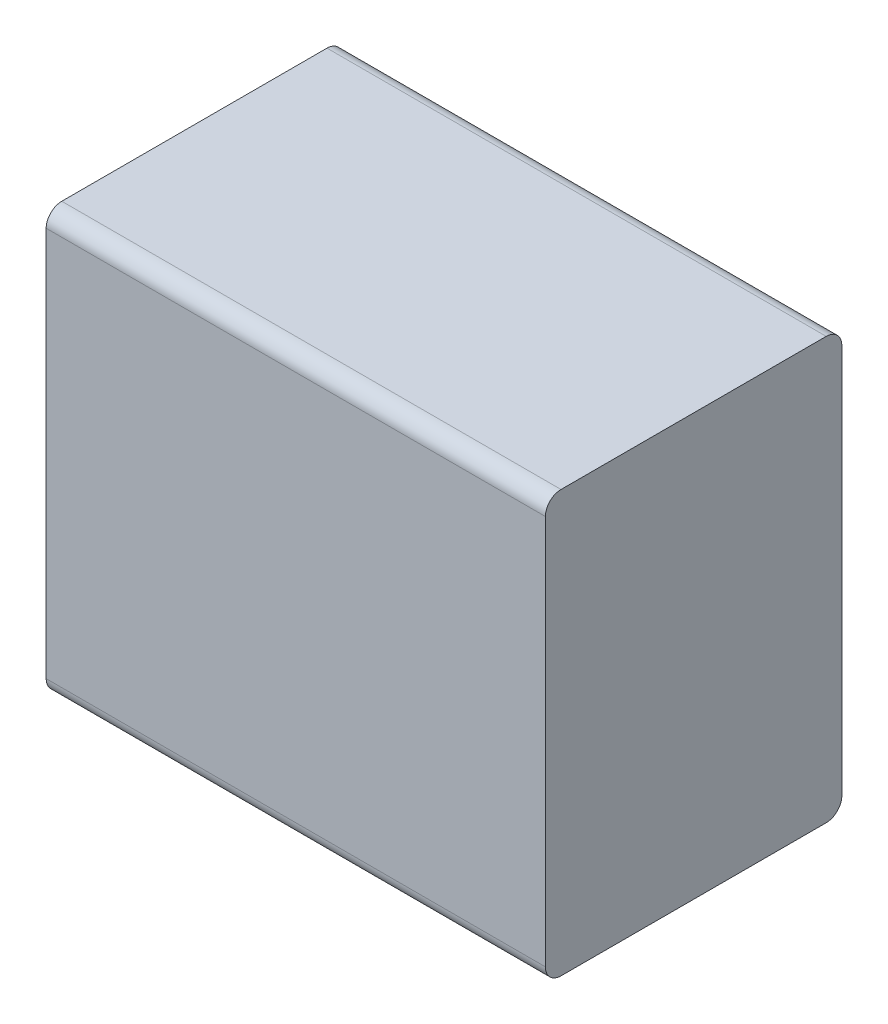
ISO-10303-21;
HEADER;
FILE_DESCRIPTION(('STEP AP214'),'2;1');
FILE_NAME('part.step','',(''),(''),'','','');
FILE_SCHEMA(('AUTOMOTIVE_DESIGN { 1 0 10303 214 1 1 1 1 }'));
ENDSEC;
DATA;
#1=APPLICATION_CONTEXT('core data for automotive mechanical design processes');
#2=APPLICATION_PROTOCOL_DEFINITION('international standard','automotive_design',2000,#1);
#3=PRODUCT_CONTEXT('',#1,'mechanical');
#4=PRODUCT('Part','Part','',(#3));
#5=PRODUCT_RELATED_PRODUCT_CATEGORY('part','',(#4));
#6=PRODUCT_DEFINITION_FORMATION('','',#4);
#7=PRODUCT_DEFINITION_CONTEXT('part definition',#1,'design');
#8=PRODUCT_DEFINITION('design','',#6,#7);
#9=PRODUCT_DEFINITION_SHAPE('','',#8);
#10=(LENGTH_UNIT() NAMED_UNIT(*) SI_UNIT(.MILLI.,.METRE.));
#11=(NAMED_UNIT(*) PLANE_ANGLE_UNIT() SI_UNIT($,.RADIAN.));
#12=(NAMED_UNIT(*) SI_UNIT($,.STERADIAN.) SOLID_ANGLE_UNIT());
#13=UNCERTAINTY_MEASURE_WITH_UNIT(LENGTH_MEASURE(1.E-05),#10,'distance_accuracy_value','');
#14=(GEOMETRIC_REPRESENTATION_CONTEXT(3) GLOBAL_UNCERTAINTY_ASSIGNED_CONTEXT((#13)) GLOBAL_UNIT_ASSIGNED_CONTEXT((#10,
#11,#12)) REPRESENTATION_CONTEXT('',''));
#15=CARTESIAN_POINT('',(0.,0.,0.));
#16=DIRECTION('',(0.,0.,1.));
#17=DIRECTION('',(1.,0.,0.));
#18=AXIS2_PLACEMENT_3D('',#15,#16,#17);
#19=CARTESIAN_POINT('',(0.,1.3,0.05));
#20=DIRECTION('',(1.,0.,0.));
#21=DIRECTION('',(0.,1.,0.));
#22=AXIS2_PLACEMENT_3D('',#19,#20,#21);
#23=CYLINDRICAL_SURFACE('',#22,0.05);
#24=DIRECTION('',(1.,0.,0.));
#25=VECTOR('',#24,1.);
#26=CARTESIAN_POINT('',(0.,1.35,0.05));
#27=LINE('',#26,#25);
#28=CARTESIAN_POINT('',(0.25,1.35,0.05));
#29=VERTEX_POINT('',#28);
#30=CARTESIAN_POINT('',(1.85,1.35,0.05));
#31=VERTEX_POINT('',#30);
#32=EDGE_CURVE('E11',#29,#31,#27,.T.);
#33=ORIENTED_EDGE('',*,*,#32,.T.);
#34=CARTESIAN_POINT('',(1.85,1.3,0.05));
#35=DIRECTION('',(1.,0.,0.));
#36=DIRECTION('',(0.,1.,0.));
#37=AXIS2_PLACEMENT_3D('',#34,#35,#36);
#38=CIRCLE('',#37,0.05);
#39=CARTESIAN_POINT('',(1.85,1.3,0.));
#40=VERTEX_POINT('',#39);
#41=EDGE_CURVE('E141',#40,#31,#38,.T.);
#42=ORIENTED_EDGE('',*,*,#41,.F.);
#43=DIRECTION('',(1.,0.,0.));
#44=VECTOR('',#43,1.);
#45=CARTESIAN_POINT('',(0.,1.3,0.));
#46=LINE('',#45,#44);
#47=CARTESIAN_POINT('',(0.25,1.3,0.));
#48=VERTEX_POINT('',#47);
#49=EDGE_CURVE('E37',#48,#40,#46,.T.);
#50=ORIENTED_EDGE('',*,*,#49,.F.);
#51=CARTESIAN_POINT('',(0.25,1.3,0.05));
#52=DIRECTION('',(1.,0.,0.));
#53=DIRECTION('',(0.,1.,0.));
#54=AXIS2_PLACEMENT_3D('',#51,#52,#53);
#55=CIRCLE('',#54,0.05);
#56=EDGE_CURVE('E119',#48,#29,#55,.T.);
#57=ORIENTED_EDGE('',*,*,#56,.T.);
#58=EDGE_LOOP('',(#33,#42,#50,#57));
#59=FACE_BOUND('',#58,.T.);
#60=ADVANCED_FACE('F17',(#59),#23,.T.);
#61=CARTESIAN_POINT('',(0.,1.35,0.));
#62=DIRECTION('',(0.,1.,0.));
#63=DIRECTION('',(1.,0.,0.));
#64=AXIS2_PLACEMENT_3D('',#61,#62,#63);
#65=PLANE('',#64);
#66=ORIENTED_EDGE('',*,*,#32,.F.);
#67=DIRECTION('',(0.,0.,1.));
#68=VECTOR('',#67,1.);
#69=CARTESIAN_POINT('',(0.25,1.35,0.));
#70=LINE('',#69,#68);
#71=CARTESIAN_POINT('',(0.25,1.35,0.9));
#72=VERTEX_POINT('',#71);
#73=EDGE_CURVE('E102',#29,#72,#70,.T.);
#74=ORIENTED_EDGE('',*,*,#73,.T.);
#75=DIRECTION('',(1.,0.,0.));
#76=VECTOR('',#75,1.);
#77=CARTESIAN_POINT('',(0.,1.35,0.9));
#78=LINE('',#77,#76);
#79=CARTESIAN_POINT('',(1.85,1.35,0.9));
#80=VERTEX_POINT('',#79);
#81=EDGE_CURVE('E25',#72,#80,#78,.T.);
#82=ORIENTED_EDGE('',*,*,#81,.T.);
#83=DIRECTION('',(0.,0.,1.));
#84=VECTOR('',#83,1.);
#85=CARTESIAN_POINT('',(1.85,1.35,0.));
#86=LINE('',#85,#84);
#87=EDGE_CURVE('E130',#31,#80,#86,.T.);
#88=ORIENTED_EDGE('',*,*,#87,.F.);
#89=EDGE_LOOP('',(#66,#74,#82,#88));
#90=FACE_BOUND('',#89,.T.);
#91=ADVANCED_FACE('F128',(#90),#65,.T.);
#92=CARTESIAN_POINT('',(0.,1.3,0.9));
#93=DIRECTION('',(1.,0.,0.));
#94=DIRECTION('',(0.,1.,0.));
#95=AXIS2_PLACEMENT_3D('',#92,#93,#94);
#96=CYLINDRICAL_SURFACE('',#95,0.05);
#97=ORIENTED_EDGE('',*,*,#81,.F.);
#98=CARTESIAN_POINT('',(0.25,1.3,0.9));
#99=DIRECTION('',(1.,0.,0.));
#100=DIRECTION('',(0.,1.,0.));
#101=AXIS2_PLACEMENT_3D('',#98,#99,#100);
#102=CIRCLE('',#101,0.05);
#103=CARTESIAN_POINT('',(0.25,1.3,0.95));
#104=VERTEX_POINT('',#103);
#105=EDGE_CURVE('E96',#72,#104,#102,.T.);
#106=ORIENTED_EDGE('',*,*,#105,.T.);
#107=DIRECTION('',(1.,0.,0.));
#108=VECTOR('',#107,1.);
#109=CARTESIAN_POINT('',(0.,1.3,0.95));
#110=LINE('',#109,#108);
#111=CARTESIAN_POINT('',(1.85,1.3,0.95));
#112=VERTEX_POINT('',#111);
#113=EDGE_CURVE('E82',#104,#112,#110,.T.);
#114=ORIENTED_EDGE('',*,*,#113,.T.);
#115=CARTESIAN_POINT('',(1.85,1.3,0.9));
#116=DIRECTION('',(1.,0.,0.));
#117=DIRECTION('',(0.,1.,0.));
#118=AXIS2_PLACEMENT_3D('',#115,#116,#117);
#119=CIRCLE('',#118,0.05);
#120=EDGE_CURVE('E134',#80,#112,#119,.T.);
#121=ORIENTED_EDGE('',*,*,#120,.F.);
#122=EDGE_LOOP('',(#97,#106,#114,#121));
#123=FACE_BOUND('',#122,.T.);
#124=ADVANCED_FACE('F97',(#123),#96,.T.);
#125=CARTESIAN_POINT('',(0.,0.,0.95));
#126=DIRECTION('',(0.,0.,1.));
#127=DIRECTION('',(1.,0.,0.));
#128=AXIS2_PLACEMENT_3D('',#125,#126,#127);
#129=PLANE('',#128);
#130=DIRECTION('',(0.,1.,0.));
#131=VECTOR('',#130,1.);
#132=CARTESIAN_POINT('',(0.25,0.,0.95));
#133=LINE('',#132,#131);
#134=CARTESIAN_POINT('',(0.25,0.05,0.95));
#135=VERTEX_POINT('',#134);
#136=EDGE_CURVE('E86',#135,#104,#133,.T.);
#137=ORIENTED_EDGE('',*,*,#136,.F.);
#138=DIRECTION('',(1.,0.,0.));
#139=VECTOR('',#138,1.);
#140=CARTESIAN_POINT('',(0.,0.05,0.95));
#141=LINE('',#140,#139);
#142=CARTESIAN_POINT('',(1.85,0.05,0.95));
#143=VERTEX_POINT('',#142);
#144=EDGE_CURVE('E113',#135,#143,#141,.T.);
#145=ORIENTED_EDGE('',*,*,#144,.T.);
#146=DIRECTION('',(0.,1.,0.));
#147=VECTOR('',#146,1.);
#148=CARTESIAN_POINT('',(1.85,0.,0.95));
#149=LINE('',#148,#147);
#150=EDGE_CURVE('E89',#143,#112,#149,.T.);
#151=ORIENTED_EDGE('',*,*,#150,.T.);
#152=ORIENTED_EDGE('',*,*,#113,.F.);
#153=EDGE_LOOP('',(#137,#145,#151,#152));
#154=FACE_BOUND('',#153,.T.);
#155=ADVANCED_FACE('F84',(#154),#129,.T.);
#156=CARTESIAN_POINT('',(0.,0.,0.));
#157=DIRECTION('',(0.,0.,1.));
#158=DIRECTION('',(1.,0.,0.));
#159=AXIS2_PLACEMENT_3D('',#156,#157,#158);
#160=PLANE('',#159);
#161=ORIENTED_EDGE('',*,*,#49,.T.);
#162=DIRECTION('',(0.,1.,0.));
#163=VECTOR('',#162,1.);
#164=CARTESIAN_POINT('',(1.85,0.,0.));
#165=LINE('',#164,#163);
#166=CARTESIAN_POINT('',(1.85,0.05,0.));
#167=VERTEX_POINT('',#166);
#168=EDGE_CURVE('E147',#167,#40,#165,.T.);
#169=ORIENTED_EDGE('',*,*,#168,.F.);
#170=DIRECTION('',(1.,0.,0.));
#171=VECTOR('',#170,1.);
#172=CARTESIAN_POINT('',(0.,0.05,0.));
#173=LINE('',#172,#171);
#174=CARTESIAN_POINT('',(0.25,0.05,0.));
#175=VERTEX_POINT('',#174);
#176=EDGE_CURVE('E170',#175,#167,#173,.T.);
#177=ORIENTED_EDGE('',*,*,#176,.F.);
#178=DIRECTION('',(0.,1.,0.));
#179=VECTOR('',#178,1.);
#180=CARTESIAN_POINT('',(0.25,0.,0.));
#181=LINE('',#180,#179);
#182=EDGE_CURVE('E120',#175,#48,#181,.T.);
#183=ORIENTED_EDGE('',*,*,#182,.T.);
#184=EDGE_LOOP('',(#161,#169,#177,#183));
#185=FACE_BOUND('',#184,.T.);
#186=ADVANCED_FACE('F219',(#185),#160,.F.);
#187=CARTESIAN_POINT('',(0.25,0.,0.));
#188=DIRECTION('',(1.,0.,0.));
#189=DIRECTION('',(0.,1.,0.));
#190=AXIS2_PLACEMENT_3D('',#187,#188,#189);
#191=PLANE('',#190);
#192=CARTESIAN_POINT('',(0.25,0.05,0.9));
#193=DIRECTION('',(1.,0.,0.));
#194=DIRECTION('',(0.,-1.,0.));
#195=AXIS2_PLACEMENT_3D('',#192,#193,#194);
#196=CIRCLE('',#195,0.05);
#197=CARTESIAN_POINT('',(0.25,0.,0.9));
#198=VERTEX_POINT('',#197);
#199=EDGE_CURVE('E107',#135,#198,#196,.T.);
#200=ORIENTED_EDGE('',*,*,#199,.F.);
#201=ORIENTED_EDGE('',*,*,#136,.T.);
#202=ORIENTED_EDGE('',*,*,#105,.F.);
#203=ORIENTED_EDGE('',*,*,#73,.F.);
#204=ORIENTED_EDGE('',*,*,#56,.F.);
#205=ORIENTED_EDGE('',*,*,#182,.F.);
#206=CARTESIAN_POINT('',(0.25,0.05,0.05));
#207=DIRECTION('',(1.,0.,0.));
#208=DIRECTION('',(0.,-1.,0.));
#209=AXIS2_PLACEMENT_3D('',#206,#207,#208);
#210=CIRCLE('',#209,0.05);
#211=CARTESIAN_POINT('',(0.25,0.,0.05));
#212=VERTEX_POINT('',#211);
#213=EDGE_CURVE('E167',#212,#175,#210,.T.);
#214=ORIENTED_EDGE('',*,*,#213,.F.);
#215=DIRECTION('',(0.,0.,1.));
#216=VECTOR('',#215,1.);
#217=CARTESIAN_POINT('',(0.25,0.,0.));
#218=LINE('',#217,#216);
#219=EDGE_CURVE('E186',#212,#198,#218,.T.);
#220=ORIENTED_EDGE('',*,*,#219,.T.);
#221=EDGE_LOOP('',(#200,#201,#202,#203,#204,#205,#214,#220));
#222=FACE_BOUND('',#221,.T.);
#223=ADVANCED_FACE('F104',(#222),#191,.F.);
#224=CARTESIAN_POINT('',(0.,0.05,0.9));
#225=DIRECTION('',(1.,0.,0.));
#226=DIRECTION('',(0.,-1.,0.));
#227=AXIS2_PLACEMENT_3D('',#224,#225,#226);
#228=CYLINDRICAL_SURFACE('',#227,0.05);
#229=DIRECTION('',(1.,0.,0.));
#230=VECTOR('',#229,1.);
#231=CARTESIAN_POINT('',(0.,0.,0.9));
#232=LINE('',#231,#230);
#233=CARTESIAN_POINT('',(1.85,0.,0.9));
#234=VERTEX_POINT('',#233);
#235=EDGE_CURVE('E184',#198,#234,#232,.T.);
#236=ORIENTED_EDGE('',*,*,#235,.T.);
#237=CARTESIAN_POINT('',(1.85,0.05,0.9));
#238=DIRECTION('',(1.,0.,0.));
#239=DIRECTION('',(0.,-1.,0.));
#240=AXIS2_PLACEMENT_3D('',#237,#238,#239);
#241=CIRCLE('',#240,0.05);
#242=EDGE_CURVE('E151',#143,#234,#241,.T.);
#243=ORIENTED_EDGE('',*,*,#242,.F.);
#244=ORIENTED_EDGE('',*,*,#144,.F.);
#245=ORIENTED_EDGE('',*,*,#199,.T.);
#246=EDGE_LOOP('',(#236,#243,#244,#245));
#247=FACE_BOUND('',#246,.T.);
#248=ADVANCED_FACE('F229',(#247),#228,.T.);
#249=CARTESIAN_POINT('',(1.85,0.,0.));
#250=DIRECTION('',(1.,0.,0.));
#251=DIRECTION('',(0.,1.,0.));
#252=AXIS2_PLACEMENT_3D('',#249,#250,#251);
#253=PLANE('',#252);
#254=DIRECTION('',(0.,0.,1.));
#255=VECTOR('',#254,1.);
#256=CARTESIAN_POINT('',(1.85,0.,0.));
#257=LINE('',#256,#255);
#258=CARTESIAN_POINT('',(1.85,0.,0.05));
#259=VERTEX_POINT('',#258);
#260=EDGE_CURVE('E193',#259,#234,#257,.T.);
#261=ORIENTED_EDGE('',*,*,#260,.F.);
#262=CARTESIAN_POINT('',(1.85,0.05,0.05));
#263=DIRECTION('',(1.,0.,0.));
#264=DIRECTION('',(0.,-1.,0.));
#265=AXIS2_PLACEMENT_3D('',#262,#263,#264);
#266=CIRCLE('',#265,0.05);
#267=EDGE_CURVE('E173',#259,#167,#266,.T.);
#268=ORIENTED_EDGE('',*,*,#267,.T.);
#269=ORIENTED_EDGE('',*,*,#168,.T.);
#270=ORIENTED_EDGE('',*,*,#41,.T.);
#271=ORIENTED_EDGE('',*,*,#87,.T.);
#272=ORIENTED_EDGE('',*,*,#120,.T.);
#273=ORIENTED_EDGE('',*,*,#150,.F.);
#274=ORIENTED_EDGE('',*,*,#242,.T.);
#275=EDGE_LOOP('',(#261,#268,#269,#270,#271,#272,#273,#274));
#276=FACE_BOUND('',#275,.T.);
#277=ADVANCED_FACE('F139',(#276),#253,.T.);
#278=CARTESIAN_POINT('',(0.,0.05,0.05));
#279=DIRECTION('',(1.,0.,0.));
#280=DIRECTION('',(0.,-1.,0.));
#281=AXIS2_PLACEMENT_3D('',#278,#279,#280);
#282=CYLINDRICAL_SURFACE('',#281,0.05);
#283=DIRECTION('',(1.,0.,0.));
#284=VECTOR('',#283,1.);
#285=CARTESIAN_POINT('',(0.,0.,0.05));
#286=LINE('',#285,#284);
#287=EDGE_CURVE('E165',#212,#259,#286,.T.);
#288=ORIENTED_EDGE('',*,*,#287,.F.);
#289=ORIENTED_EDGE('',*,*,#213,.T.);
#290=ORIENTED_EDGE('',*,*,#176,.T.);
#291=ORIENTED_EDGE('',*,*,#267,.F.);
#292=EDGE_LOOP('',(#288,#289,#290,#291));
#293=FACE_BOUND('',#292,.T.);
#294=ADVANCED_FACE('F220',(#293),#282,.T.);
#295=CARTESIAN_POINT('',(0.,0.,0.));
#296=DIRECTION('',(0.,1.,0.));
#297=DIRECTION('',(1.,0.,0.));
#298=AXIS2_PLACEMENT_3D('',#295,#296,#297);
#299=PLANE('',#298);
#300=ORIENTED_EDGE('',*,*,#260,.T.);
#301=ORIENTED_EDGE('',*,*,#235,.F.);
#302=ORIENTED_EDGE('',*,*,#219,.F.);
#303=ORIENTED_EDGE('',*,*,#287,.T.);
#304=EDGE_LOOP('',(#300,#301,#302,#303));
#305=FACE_BOUND('',#304,.T.);
#306=ADVANCED_FACE('F200',(#305),#299,.F.);
#307=CLOSED_SHELL('',(#60,#91,#124,#155,#186,#223,#248,#277,#294,#306));
#308=MANIFOLD_SOLID_BREP('B1',#307);
#309=ADVANCED_BREP_SHAPE_REPRESENTATION('',(#18,#308),#14);
#310=SHAPE_DEFINITION_REPRESENTATION(#9,#309);
ENDSEC;
END-ISO-10303-21;
